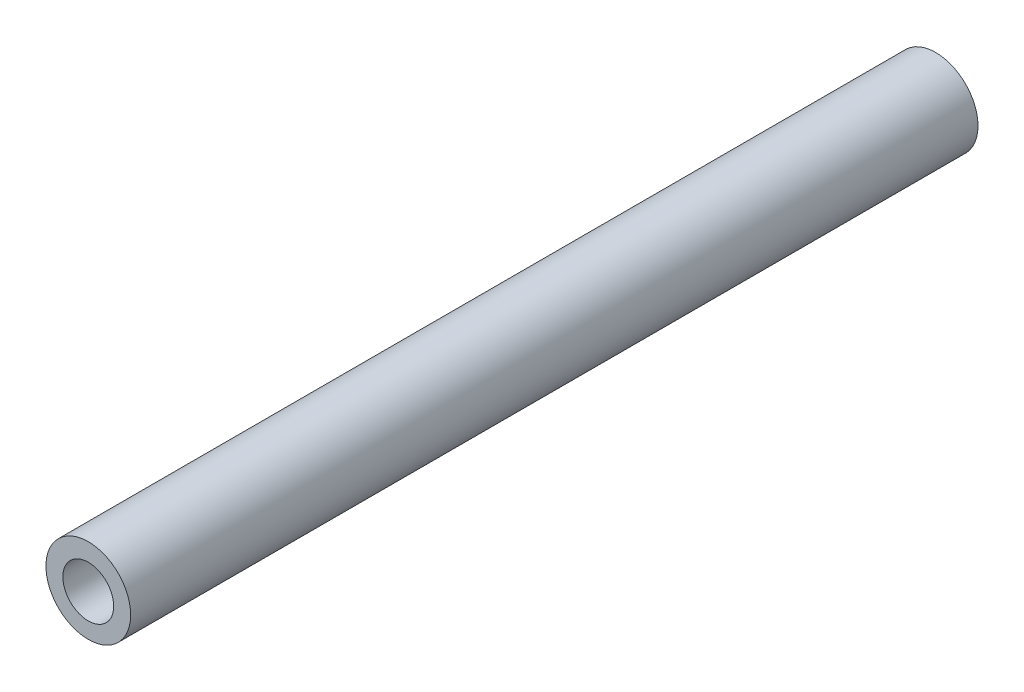
ISO-10303-21;
HEADER;
FILE_DESCRIPTION(('STEP AP214'),'2;1');
FILE_NAME('part.step','',(''),(''),'','','');
FILE_SCHEMA(('AUTOMOTIVE_DESIGN { 1 0 10303 214 1 1 1 1 }'));
ENDSEC;
DATA;
#1=APPLICATION_CONTEXT('core data for automotive mechanical design processes');
#2=APPLICATION_PROTOCOL_DEFINITION('international standard','automotive_design',2000,#1);
#3=PRODUCT_CONTEXT('',#1,'mechanical');
#4=PRODUCT('Part','Part','',(#3));
#5=PRODUCT_RELATED_PRODUCT_CATEGORY('part','',(#4));
#6=PRODUCT_DEFINITION_FORMATION('','',#4);
#7=PRODUCT_DEFINITION_CONTEXT('part definition',#1,'design');
#8=PRODUCT_DEFINITION('design','',#6,#7);
#9=PRODUCT_DEFINITION_SHAPE('','',#8);
#10=(LENGTH_UNIT() NAMED_UNIT(*) SI_UNIT(.MILLI.,.METRE.));
#11=(NAMED_UNIT(*) PLANE_ANGLE_UNIT() SI_UNIT($,.RADIAN.));
#12=(NAMED_UNIT(*) SI_UNIT($,.STERADIAN.) SOLID_ANGLE_UNIT());
#13=UNCERTAINTY_MEASURE_WITH_UNIT(LENGTH_MEASURE(1.E-05),#10,'distance_accuracy_value','');
#14=(GEOMETRIC_REPRESENTATION_CONTEXT(3) GLOBAL_UNCERTAINTY_ASSIGNED_CONTEXT((#13)) GLOBAL_UNIT_ASSIGNED_CONTEXT((#10,
#11,#12)) REPRESENTATION_CONTEXT('',''));
#15=CARTESIAN_POINT('',(0.,0.,0.));
#16=DIRECTION('',(0.,0.,1.));
#17=DIRECTION('',(1.,0.,0.));
#18=AXIS2_PLACEMENT_3D('',#15,#16,#17);
#19=CARTESIAN_POINT('',(0.0522885789394772,0.183010026288174,100.));
#20=DIRECTION('',(0.,0.,1.));
#21=DIRECTION('',(1.,0.,0.));
#22=AXIS2_PLACEMENT_3D('',#19,#20,#21);
#23=PLANE('',#22);
#24=CARTESIAN_POINT('',(0.0522885789394772,0.183010026288174,100.));
#25=DIRECTION('',(0.,0.,1.));
#26=DIRECTION('',(1.,0.,0.));
#27=AXIS2_PLACEMENT_3D('',#24,#25,#26);
#28=CIRCLE('',#27,5.);
#29=CARTESIAN_POINT('',(5.05228857893948,0.183010026288174,100.));
#30=VERTEX_POINT('',#29);
#31=EDGE_CURVE('E10',#30,#30,#28,.T.);
#32=ORIENTED_EDGE('',*,*,#31,.T.);
#33=EDGE_LOOP('',(#32));
#34=FACE_BOUND('',#33,.T.);
#35=CARTESIAN_POINT('',(0.0522885789394731,0.0784328684092173,100.));
#36=DIRECTION('',(0.,0.,1.));
#37=DIRECTION('',(1.,0.,0.));
#38=AXIS2_PLACEMENT_3D('',#35,#36,#37);
#39=CIRCLE('',#38,3.);
#40=CARTESIAN_POINT('',(3.05228857893947,0.0784328684092173,100.));
#41=VERTEX_POINT('',#40);
#42=EDGE_CURVE('E50',#41,#41,#39,.T.);
#43=ORIENTED_EDGE('',*,*,#42,.F.);
#44=EDGE_LOOP('',(#43));
#45=FACE_BOUND('',#44,.T.);
#46=ADVANCED_FACE('F37',(#34,#45),#23,.T.);
#47=CARTESIAN_POINT('',(0.0522885789394772,0.183010026288174,0.));
#48=DIRECTION('',(0.,0.,1.));
#49=DIRECTION('',(1.,0.,0.));
#50=AXIS2_PLACEMENT_3D('',#47,#48,#49);
#51=PLANE('',#50);
#52=CARTESIAN_POINT('',(0.0522885789394772,0.183010026288174,0.));
#53=DIRECTION('',(0.,0.,1.));
#54=DIRECTION('',(1.,0.,0.));
#55=AXIS2_PLACEMENT_3D('',#52,#53,#54);
#56=CIRCLE('',#55,5.);
#57=CARTESIAN_POINT('',(5.05228857893948,0.183010026288174,0.));
#58=VERTEX_POINT('',#57);
#59=EDGE_CURVE('E41',#58,#58,#56,.T.);
#60=ORIENTED_EDGE('',*,*,#59,.F.);
#61=EDGE_LOOP('',(#60));
#62=FACE_BOUND('',#61,.T.);
#63=CARTESIAN_POINT('',(0.0522885789394731,0.0784328684092173,0.));
#64=DIRECTION('',(0.,0.,1.));
#65=DIRECTION('',(1.,0.,0.));
#66=AXIS2_PLACEMENT_3D('',#63,#64,#65);
#67=CIRCLE('',#66,3.);
#68=CARTESIAN_POINT('',(3.05228857893947,0.0784328684092173,0.));
#69=VERTEX_POINT('',#68);
#70=EDGE_CURVE('E52',#69,#69,#67,.T.);
#71=ORIENTED_EDGE('',*,*,#70,.T.);
#72=EDGE_LOOP('',(#71));
#73=FACE_BOUND('',#72,.T.);
#74=ADVANCED_FACE('F64',(#62,#73),#51,.F.);
#75=CARTESIAN_POINT('',(0.0522885789394772,0.183010026288174,100.));
#76=DIRECTION('',(0.,0.,-1.));
#77=DIRECTION('',(-1.,0.,0.));
#78=AXIS2_PLACEMENT_3D('',#75,#76,#77);
#79=CYLINDRICAL_SURFACE('',#78,5.);
#80=ORIENTED_EDGE('',*,*,#31,.F.);
#81=EDGE_LOOP('',(#80));
#82=FACE_BOUND('',#81,.T.);
#83=ORIENTED_EDGE('',*,*,#59,.T.);
#84=EDGE_LOOP('',(#83));
#85=FACE_BOUND('',#84,.T.);
#86=ADVANCED_FACE('F39',(#82,#85),#79,.T.);
#87=CARTESIAN_POINT('',(0.0522885789394731,0.0784328684092173,100.));
#88=DIRECTION('',(0.,0.,-1.));
#89=DIRECTION('',(-1.,0.,0.));
#90=AXIS2_PLACEMENT_3D('',#87,#88,#89);
#91=CYLINDRICAL_SURFACE('',#90,3.);
#92=ORIENTED_EDGE('',*,*,#42,.T.);
#93=EDGE_LOOP('',(#92));
#94=FACE_BOUND('',#93,.T.);
#95=ORIENTED_EDGE('',*,*,#70,.F.);
#96=EDGE_LOOP('',(#95));
#97=FACE_BOUND('',#96,.T.);
#98=ADVANCED_FACE('F60',(#94,#97),#91,.F.);
#99=CLOSED_SHELL('',(#46,#74,#86,#98));
#100=MANIFOLD_SOLID_BREP('B2',#99);
#101=ADVANCED_BREP_SHAPE_REPRESENTATION('',(#18,#100),#14);
#102=SHAPE_DEFINITION_REPRESENTATION(#9,#101);
ENDSEC;
END-ISO-10303-21;
